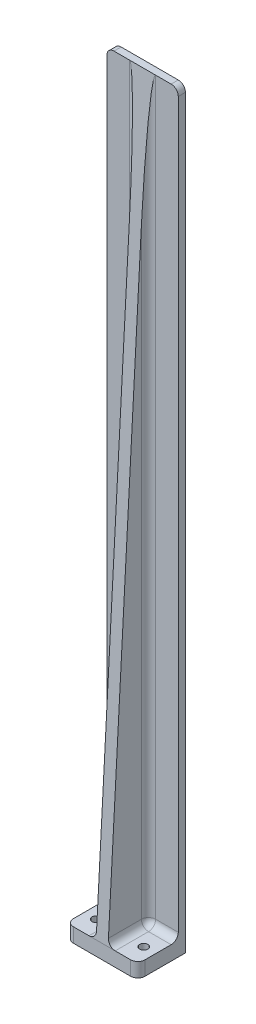
ISO-10303-21;
HEADER;
FILE_DESCRIPTION(('STEP AP214'),'2;1');
FILE_NAME('part.step','',(''),(''),'','','');
FILE_SCHEMA(('AUTOMOTIVE_DESIGN { 1 0 10303 214 1 1 1 1 }'));
ENDSEC;
DATA;
#1=APPLICATION_CONTEXT('core data for automotive mechanical design processes');
#2=APPLICATION_PROTOCOL_DEFINITION('international standard','automotive_design',2000,#1);
#3=PRODUCT_CONTEXT('',#1,'mechanical');
#4=PRODUCT('Part','Part','',(#3));
#5=PRODUCT_RELATED_PRODUCT_CATEGORY('part','',(#4));
#6=PRODUCT_DEFINITION_FORMATION('','',#4);
#7=PRODUCT_DEFINITION_CONTEXT('part definition',#1,'design');
#8=PRODUCT_DEFINITION('design','',#6,#7);
#9=PRODUCT_DEFINITION_SHAPE('','',#8);
#10=(LENGTH_UNIT() NAMED_UNIT(*) SI_UNIT(.MILLI.,.METRE.));
#11=(NAMED_UNIT(*) PLANE_ANGLE_UNIT() SI_UNIT($,.RADIAN.));
#12=(NAMED_UNIT(*) SI_UNIT($,.STERADIAN.) SOLID_ANGLE_UNIT());
#13=UNCERTAINTY_MEASURE_WITH_UNIT(LENGTH_MEASURE(1.E-05),#10,'distance_accuracy_value','');
#14=(GEOMETRIC_REPRESENTATION_CONTEXT(3) GLOBAL_UNCERTAINTY_ASSIGNED_CONTEXT((#13)) GLOBAL_UNIT_ASSIGNED_CONTEXT((#10,
#11,#12)) REPRESENTATION_CONTEXT('',''));
#15=CARTESIAN_POINT('',(0.,0.,0.));
#16=DIRECTION('',(0.,0.,1.));
#17=DIRECTION('',(1.,0.,0.));
#18=AXIS2_PLACEMENT_3D('',#15,#16,#17);
#19=CARTESIAN_POINT('',(0.,6.,0.));
#20=DIRECTION('',(0.,-1.,0.));
#21=DIRECTION('',(0.,0.,-1.));
#22=AXIS2_PLACEMENT_3D('',#19,#20,#21);
#23=PLANE('',#22);
#24=CARTESIAN_POINT('',(10.,6.,2.5));
#25=DIRECTION('',(0.,1.,0.));
#26=DIRECTION('',(0.,0.,-1.));
#27=AXIS2_PLACEMENT_3D('',#24,#25,#26);
#28=CIRCLE('',#27,1.75);
#29=CARTESIAN_POINT('',(10.,6.,0.75));
#30=VERTEX_POINT('',#29);
#31=EDGE_CURVE('E392',#30,#30,#28,.T.);
#32=ORIENTED_EDGE('',*,*,#31,.F.);
#33=EDGE_LOOP('',(#32));
#34=FACE_BOUND('',#33,.T.);
#35=DIRECTION('',(1.,0.,0.));
#36=VECTOR('',#35,1.);
#37=CARTESIAN_POINT('',(-15.,6.,10.));
#38=LINE('',#37,#36);
#39=CARTESIAN_POINT('',(5.5,6.,10.));
#40=VERTEX_POINT('',#39);
#41=CARTESIAN_POINT('',(12.,6.,10.));
#42=VERTEX_POINT('',#41);
#43=EDGE_CURVE('E412',#40,#42,#38,.T.);
#44=ORIENTED_EDGE('',*,*,#43,.T.);
#45=CARTESIAN_POINT('',(12.,6.,7.));
#46=DIRECTION('',(0.,-1.,0.));
#47=DIRECTION('',(0.,0.,-1.));
#48=AXIS2_PLACEMENT_3D('',#45,#46,#47);
#49=CIRCLE('',#48,3.);
#50=CARTESIAN_POINT('',(15.,6.,7.));
#51=VERTEX_POINT('',#50);
#52=EDGE_CURVE('E276',#42,#51,#49,.F.);
#53=ORIENTED_EDGE('',*,*,#52,.T.);
#54=DIRECTION('',(0.,0.,-1.));
#55=VECTOR('',#54,1.);
#56=CARTESIAN_POINT('',(15.,6.,10.));
#57=LINE('',#56,#55);
#58=CARTESIAN_POINT('',(15.,6.,-4.));
#59=VERTEX_POINT('',#58);
#60=EDGE_CURVE('E210',#51,#59,#57,.T.);
#61=ORIENTED_EDGE('',*,*,#60,.T.);
#62=DIRECTION('',(1.,0.,0.));
#63=VECTOR('',#62,1.);
#64=CARTESIAN_POINT('',(0.,6.,-4.));
#65=LINE('',#64,#63);
#66=CARTESIAN_POINT('',(5.5,6.,-4.));
#67=VERTEX_POINT('',#66);
#68=EDGE_CURVE('E273',#59,#67,#65,.F.);
#69=ORIENTED_EDGE('',*,*,#68,.T.);
#70=DIRECTION('',(0.,0.,-1.));
#71=VECTOR('',#70,1.);
#72=CARTESIAN_POINT('',(5.5,6.,10.));
#73=LINE('',#72,#71);
#74=EDGE_CURVE('E269',#67,#40,#73,.F.);
#75=ORIENTED_EDGE('',*,*,#74,.T.);
#76=EDGE_LOOP('',(#44,#53,#61,#69,#75));
#77=FACE_BOUND('',#76,.T.);
#78=ADVANCED_FACE('F45',(#34,#77),#23,.F.);
#79=CARTESIAN_POINT('',(-15.,6.,-7.));
#80=DIRECTION('',(0.,0.,1.));
#81=DIRECTION('',(1.,0.,0.));
#82=AXIS2_PLACEMENT_3D('',#79,#80,#81);
#83=PLANE('',#82);
#84=DIRECTION('',(0.,-1.,0.));
#85=VECTOR('',#84,1.);
#86=CARTESIAN_POINT('',(15.,6.,-7.));
#87=LINE('',#86,#85);
#88=CARTESIAN_POINT('',(15.,313.,-7.));
#89=VERTEX_POINT('',#88);
#90=CARTESIAN_POINT('',(15.,9.,-7.));
#91=VERTEX_POINT('',#90);
#92=EDGE_CURVE('E376',#89,#91,#87,.T.);
#93=ORIENTED_EDGE('',*,*,#92,.F.);
#94=CARTESIAN_POINT('',(12.,313.,-7.));
#95=DIRECTION('',(0.,0.,1.));
#96=DIRECTION('',(1.,0.,0.));
#97=AXIS2_PLACEMENT_3D('',#94,#95,#96);
#98=CIRCLE('',#97,3.);
#99=CARTESIAN_POINT('',(12.,316.,-7.));
#100=VERTEX_POINT('',#99);
#101=EDGE_CURVE('E253',#89,#100,#98,.T.);
#102=ORIENTED_EDGE('',*,*,#101,.T.);
#103=DIRECTION('',(1.,0.,0.));
#104=VECTOR('',#103,1.);
#105=CARTESIAN_POINT('',(-15.,316.,-7.));
#106=LINE('',#105,#104);
#107=CARTESIAN_POINT('',(5.5,316.,-7.));
#108=VERTEX_POINT('',#107);
#109=EDGE_CURVE('E385',#108,#100,#106,.T.);
#110=ORIENTED_EDGE('',*,*,#109,.F.);
#111=DIRECTION('',(0.,1.,0.));
#112=VECTOR('',#111,1.);
#113=CARTESIAN_POINT('',(5.5,6.,-7.));
#114=LINE('',#113,#112);
#115=CARTESIAN_POINT('',(5.5,9.,-7.));
#116=VERTEX_POINT('',#115);
#117=EDGE_CURVE('E246',#108,#116,#114,.F.);
#118=ORIENTED_EDGE('',*,*,#117,.T.);
#119=DIRECTION('',(1.,0.,0.));
#120=VECTOR('',#119,1.);
#121=CARTESIAN_POINT('',(-15.,9.,-7.));
#122=LINE('',#121,#120);
#123=EDGE_CURVE('E249',#116,#91,#122,.T.);
#124=ORIENTED_EDGE('',*,*,#123,.T.);
#125=EDGE_LOOP('',(#93,#102,#110,#118,#124));
#126=FACE_BOUND('',#125,.T.);
#127=ADVANCED_FACE('F457',(#126),#83,.T.);
#128=CARTESIAN_POINT('',(-10.,6.,2.5));
#129=DIRECTION('',(0.,1.,0.));
#130=DIRECTION('',(0.,0.,1.));
#131=AXIS2_PLACEMENT_3D('',#128,#129,#130);
#132=CIRCLE('',#131,1.75);
#133=CARTESIAN_POINT('',(-10.,6.,4.25));
#134=VERTEX_POINT('',#133);
#135=EDGE_CURVE('E182',#134,#134,#132,.T.);
#136=ORIENTED_EDGE('',*,*,#135,.F.);
#137=EDGE_LOOP('',(#136));
#138=FACE_BOUND('',#137,.T.);
#139=DIRECTION('',(0.,0.,1.));
#140=VECTOR('',#139,1.);
#141=CARTESIAN_POINT('',(-15.,6.,10.));
#142=LINE('',#141,#140);
#143=CARTESIAN_POINT('',(-15.,6.,-4.));
#144=VERTEX_POINT('',#143);
#145=CARTESIAN_POINT('',(-15.,6.,7.));
#146=VERTEX_POINT('',#145);
#147=EDGE_CURVE('E410',#144,#146,#142,.T.);
#148=ORIENTED_EDGE('',*,*,#147,.T.);
#149=CARTESIAN_POINT('',(-12.,6.,7.));
#150=DIRECTION('',(0.,-1.,0.));
#151=DIRECTION('',(0.,0.,-1.));
#152=AXIS2_PLACEMENT_3D('',#149,#150,#151);
#153=CIRCLE('',#152,3.);
#154=CARTESIAN_POINT('',(-12.,6.,10.));
#155=VERTEX_POINT('',#154);
#156=EDGE_CURVE('E286',#146,#155,#153,.F.);
#157=ORIENTED_EDGE('',*,*,#156,.T.);
#158=CARTESIAN_POINT('',(-5.5,6.,10.));
#159=VERTEX_POINT('',#158);
#160=EDGE_CURVE('E212',#155,#159,#38,.T.);
#161=ORIENTED_EDGE('',*,*,#160,.T.);
#162=DIRECTION('',(0.,0.,-1.));
#163=VECTOR('',#162,1.);
#164=CARTESIAN_POINT('',(-5.5,6.,0.));
#165=LINE('',#164,#163);
#166=CARTESIAN_POINT('',(-5.5,6.,-4.));
#167=VERTEX_POINT('',#166);
#168=EDGE_CURVE('E282',#159,#167,#165,.T.);
#169=ORIENTED_EDGE('',*,*,#168,.T.);
#170=DIRECTION('',(1.,0.,0.));
#171=VECTOR('',#170,1.);
#172=CARTESIAN_POINT('',(0.,6.,-4.));
#173=LINE('',#172,#171);
#174=EDGE_CURVE('E279',#167,#144,#173,.F.);
#175=ORIENTED_EDGE('',*,*,#174,.T.);
#176=EDGE_LOOP('',(#148,#157,#161,#169,#175));
#177=FACE_BOUND('',#176,.T.);
#178=ADVANCED_FACE('F350',(#138,#177),#23,.F.);
#179=CARTESIAN_POINT('',(0.,0.,0.));
#180=DIRECTION('',(0.,-1.,0.));
#181=DIRECTION('',(0.,0.,-1.));
#182=AXIS2_PLACEMENT_3D('',#179,#180,#181);
#183=PLANE('',#182);
#184=CARTESIAN_POINT('',(-10.,0.,2.5));
#185=DIRECTION('',(0.,1.,0.));
#186=DIRECTION('',(0.,0.,1.));
#187=AXIS2_PLACEMENT_3D('',#184,#185,#186);
#188=CIRCLE('',#187,1.75);
#189=CARTESIAN_POINT('',(-10.,0.,4.25));
#190=VERTEX_POINT('',#189);
#191=EDGE_CURVE('E396',#190,#190,#188,.T.);
#192=ORIENTED_EDGE('',*,*,#191,.T.);
#193=EDGE_LOOP('',(#192));
#194=FACE_BOUND('',#193,.T.);
#195=DIRECTION('',(0.,0.,-1.));
#196=VECTOR('',#195,1.);
#197=CARTESIAN_POINT('',(15.,0.,10.));
#198=LINE('',#197,#196);
#199=CARTESIAN_POINT('',(15.,0.,7.));
#200=VERTEX_POINT('',#199);
#201=CARTESIAN_POINT('',(15.,0.,-10.));
#202=VERTEX_POINT('',#201);
#203=EDGE_CURVE('E169',#200,#202,#198,.T.);
#204=ORIENTED_EDGE('',*,*,#203,.F.);
#205=CARTESIAN_POINT('',(12.,0.,7.));
#206=DIRECTION('',(0.,-1.,0.));
#207=DIRECTION('',(0.,0.,-1.));
#208=AXIS2_PLACEMENT_3D('',#205,#206,#207);
#209=CIRCLE('',#208,3.);
#210=CARTESIAN_POINT('',(12.,0.,10.));
#211=VERTEX_POINT('',#210);
#212=EDGE_CURVE('E259',#200,#211,#209,.T.);
#213=ORIENTED_EDGE('',*,*,#212,.T.);
#214=DIRECTION('',(1.,0.,0.));
#215=VECTOR('',#214,1.);
#216=CARTESIAN_POINT('',(-15.,0.,10.));
#217=LINE('',#216,#215);
#218=CARTESIAN_POINT('',(-12.,0.,10.));
#219=VERTEX_POINT('',#218);
#220=EDGE_CURVE('E203',#219,#211,#217,.T.);
#221=ORIENTED_EDGE('',*,*,#220,.F.);
#222=CARTESIAN_POINT('',(-12.,0.,7.));
#223=DIRECTION('',(0.,-1.,0.));
#224=DIRECTION('',(0.,0.,-1.));
#225=AXIS2_PLACEMENT_3D('',#222,#223,#224);
#226=CIRCLE('',#225,3.);
#227=CARTESIAN_POINT('',(-15.,0.,7.));
#228=VERTEX_POINT('',#227);
#229=EDGE_CURVE('E256',#219,#228,#226,.T.);
#230=ORIENTED_EDGE('',*,*,#229,.T.);
#231=DIRECTION('',(0.,0.,1.));
#232=VECTOR('',#231,1.);
#233=CARTESIAN_POINT('',(-15.,0.,10.));
#234=LINE('',#233,#232);
#235=CARTESIAN_POINT('',(-15.,0.,-10.));
#236=VERTEX_POINT('',#235);
#237=EDGE_CURVE('E199',#236,#228,#234,.T.);
#238=ORIENTED_EDGE('',*,*,#237,.F.);
#239=DIRECTION('',(-1.,0.,0.));
#240=VECTOR('',#239,1.);
#241=CARTESIAN_POINT('',(-15.,0.,-10.));
#242=LINE('',#241,#240);
#243=EDGE_CURVE('E181',#202,#236,#242,.T.);
#244=ORIENTED_EDGE('',*,*,#243,.F.);
#245=EDGE_LOOP('',(#204,#213,#221,#230,#238,#244));
#246=FACE_BOUND('',#245,.T.);
#247=CARTESIAN_POINT('',(10.,0.,2.5));
#248=DIRECTION('',(0.,1.,0.));
#249=DIRECTION('',(0.,0.,-1.));
#250=AXIS2_PLACEMENT_3D('',#247,#248,#249);
#251=CIRCLE('',#250,1.75);
#252=CARTESIAN_POINT('',(10.,0.,0.75));
#253=VERTEX_POINT('',#252);
#254=EDGE_CURVE('E397',#253,#253,#251,.T.);
#255=ORIENTED_EDGE('',*,*,#254,.T.);
#256=EDGE_LOOP('',(#255));
#257=FACE_BOUND('',#256,.T.);
#258=ADVANCED_FACE('F196',(#194,#246,#257),#183,.T.);
#259=CARTESIAN_POINT('',(15.,6.,10.));
#260=DIRECTION('',(-1.,0.,0.));
#261=DIRECTION('',(0.,0.,1.));
#262=AXIS2_PLACEMENT_3D('',#259,#260,#261);
#263=PLANE('',#262);
#264=DIRECTION('',(0.,-1.,0.));
#265=VECTOR('',#264,1.);
#266=CARTESIAN_POINT('',(15.,6.,-10.));
#267=LINE('',#266,#265);
#268=CARTESIAN_POINT('',(15.,313.,-10.));
#269=VERTEX_POINT('',#268);
#270=EDGE_CURVE('E173',#269,#202,#267,.T.);
#271=ORIENTED_EDGE('',*,*,#270,.F.);
#272=DIRECTION('',(0.,0.,1.));
#273=VECTOR('',#272,1.);
#274=CARTESIAN_POINT('',(15.,313.,-7.));
#275=LINE('',#274,#273);
#276=EDGE_CURVE('E243',#269,#89,#275,.T.);
#277=ORIENTED_EDGE('',*,*,#276,.T.);
#278=ORIENTED_EDGE('',*,*,#92,.T.);
#279=CARTESIAN_POINT('',(15.,9.,-4.));
#280=DIRECTION('',(-1.,0.,0.));
#281=DIRECTION('',(0.,0.,1.));
#282=AXIS2_PLACEMENT_3D('',#279,#280,#281);
#283=CIRCLE('',#282,3.);
#284=EDGE_CURVE('E301',#91,#59,#283,.T.);
#285=ORIENTED_EDGE('',*,*,#284,.T.);
#286=ORIENTED_EDGE('',*,*,#60,.F.);
#287=DIRECTION('',(0.,-1.,0.));
#288=VECTOR('',#287,1.);
#289=CARTESIAN_POINT('',(15.,6.,7.));
#290=LINE('',#289,#288);
#291=EDGE_CURVE('E177',#51,#200,#290,.T.);
#292=ORIENTED_EDGE('',*,*,#291,.T.);
#293=ORIENTED_EDGE('',*,*,#203,.T.);
#294=EDGE_LOOP('',(#271,#277,#278,#285,#286,#292,#293));
#295=FACE_BOUND('',#294,.T.);
#296=ADVANCED_FACE('F171',(#295),#263,.F.);
#297=CARTESIAN_POINT('',(-15.,6.,-10.));
#298=DIRECTION('',(0.,0.,1.));
#299=DIRECTION('',(1.,0.,0.));
#300=AXIS2_PLACEMENT_3D('',#297,#298,#299);
#301=PLANE('',#300);
#302=DIRECTION('',(0.,-1.,0.));
#303=VECTOR('',#302,1.);
#304=CARTESIAN_POINT('',(-15.,6.,-10.));
#305=LINE('',#304,#303);
#306=CARTESIAN_POINT('',(-15.,313.,-10.));
#307=VERTEX_POINT('',#306);
#308=EDGE_CURVE('E194',#307,#236,#305,.T.);
#309=ORIENTED_EDGE('',*,*,#308,.F.);
#310=CARTESIAN_POINT('',(-12.,313.,-10.));
#311=DIRECTION('',(0.,0.,1.));
#312=DIRECTION('',(1.,0.,0.));
#313=AXIS2_PLACEMENT_3D('',#310,#311,#312);
#314=CIRCLE('',#313,3.);
#315=CARTESIAN_POINT('',(-12.,316.,-10.));
#316=VERTEX_POINT('',#315);
#317=EDGE_CURVE('E238',#307,#316,#314,.F.);
#318=ORIENTED_EDGE('',*,*,#317,.T.);
#319=DIRECTION('',(1.,0.,0.));
#320=VECTOR('',#319,1.);
#321=CARTESIAN_POINT('',(-15.,316.,-10.));
#322=LINE('',#321,#320);
#323=CARTESIAN_POINT('',(12.,316.,-10.));
#324=VERTEX_POINT('',#323);
#325=EDGE_CURVE('E381',#316,#324,#322,.T.);
#326=ORIENTED_EDGE('',*,*,#325,.T.);
#327=CARTESIAN_POINT('',(12.,313.,-10.));
#328=DIRECTION('',(0.,0.,1.));
#329=DIRECTION('',(1.,0.,0.));
#330=AXIS2_PLACEMENT_3D('',#327,#328,#329);
#331=CIRCLE('',#330,3.);
#332=EDGE_CURVE('E191',#324,#269,#331,.F.);
#333=ORIENTED_EDGE('',*,*,#332,.T.);
#334=ORIENTED_EDGE('',*,*,#270,.T.);
#335=ORIENTED_EDGE('',*,*,#243,.T.);
#336=EDGE_LOOP('',(#309,#318,#326,#333,#334,#335));
#337=FACE_BOUND('',#336,.T.);
#338=ADVANCED_FACE('F187',(#337),#301,.F.);
#339=CARTESIAN_POINT('',(-15.,6.,10.));
#340=DIRECTION('',(1.,0.,0.));
#341=DIRECTION('',(0.,0.,-1.));
#342=AXIS2_PLACEMENT_3D('',#339,#340,#341);
#343=PLANE('',#342);
#344=DIRECTION('',(0.,-1.,0.));
#345=VECTOR('',#344,1.);
#346=CARTESIAN_POINT('',(-15.,6.,-7.));
#347=LINE('',#346,#345);
#348=CARTESIAN_POINT('',(-15.,313.,-7.));
#349=VERTEX_POINT('',#348);
#350=CARTESIAN_POINT('',(-15.,9.,-7.));
#351=VERTEX_POINT('',#350);
#352=EDGE_CURVE('E377',#349,#351,#347,.T.);
#353=ORIENTED_EDGE('',*,*,#352,.F.);
#354=DIRECTION('',(0.,0.,1.));
#355=VECTOR('',#354,1.);
#356=CARTESIAN_POINT('',(-15.,313.,-10.));
#357=LINE('',#356,#355);
#358=EDGE_CURVE('E233',#349,#307,#357,.F.);
#359=ORIENTED_EDGE('',*,*,#358,.T.);
#360=ORIENTED_EDGE('',*,*,#308,.T.);
#361=ORIENTED_EDGE('',*,*,#237,.T.);
#362=DIRECTION('',(0.,-1.,0.));
#363=VECTOR('',#362,1.);
#364=CARTESIAN_POINT('',(-15.,6.,7.));
#365=LINE('',#364,#363);
#366=EDGE_CURVE('E230',#228,#146,#365,.F.);
#367=ORIENTED_EDGE('',*,*,#366,.T.);
#368=ORIENTED_EDGE('',*,*,#147,.F.);
#369=CARTESIAN_POINT('',(-15.,9.,-4.));
#370=DIRECTION('',(1.,0.,0.));
#371=DIRECTION('',(0.,0.,-1.));
#372=AXIS2_PLACEMENT_3D('',#369,#370,#371);
#373=CIRCLE('',#372,3.);
#374=EDGE_CURVE('E11',#144,#351,#373,.T.);
#375=ORIENTED_EDGE('',*,*,#374,.T.);
#376=EDGE_LOOP('',(#353,#359,#360,#361,#367,#368,#375));
#377=FACE_BOUND('',#376,.T.);
#378=ADVANCED_FACE('F432',(#377),#343,.F.);
#379=CARTESIAN_POINT('',(-15.,6.,10.));
#380=DIRECTION('',(0.,0.,-1.));
#381=DIRECTION('',(-1.,0.,0.));
#382=AXIS2_PLACEMENT_3D('',#379,#380,#381);
#383=PLANE('',#382);
#384=ORIENTED_EDGE('',*,*,#220,.T.);
#385=DIRECTION('',(0.,-1.,0.));
#386=VECTOR('',#385,1.);
#387=CARTESIAN_POINT('',(12.,6.,10.));
#388=LINE('',#387,#386);
#389=EDGE_CURVE('E266',#211,#42,#388,.F.);
#390=ORIENTED_EDGE('',*,*,#389,.T.);
#391=ORIENTED_EDGE('',*,*,#43,.F.);
#392=DIRECTION('',(-1.,0.,0.));
#393=VECTOR('',#392,1.);
#394=CARTESIAN_POINT('',(2.5,6.,10.));
#395=LINE('',#394,#393);
#396=EDGE_CURVE('E64',#40,#159,#395,.T.);
#397=ORIENTED_EDGE('',*,*,#396,.T.);
#398=ORIENTED_EDGE('',*,*,#160,.F.);
#399=DIRECTION('',(0.,-1.,0.));
#400=VECTOR('',#399,1.);
#401=CARTESIAN_POINT('',(-12.,6.,10.));
#402=LINE('',#401,#400);
#403=EDGE_CURVE('E262',#155,#219,#402,.T.);
#404=ORIENTED_EDGE('',*,*,#403,.T.);
#405=EDGE_LOOP('',(#384,#390,#391,#397,#398,#404));
#406=FACE_BOUND('',#405,.T.);
#407=ADVANCED_FACE('F424',(#406),#383,.F.);
#408=CARTESIAN_POINT('',(-10.,6.,2.5));
#409=DIRECTION('',(0.,-1.,0.));
#410=DIRECTION('',(0.,0.,-1.));
#411=AXIS2_PLACEMENT_3D('',#408,#409,#410);
#412=CYLINDRICAL_SURFACE('',#411,1.75);
#413=ORIENTED_EDGE('',*,*,#135,.T.);
#414=EDGE_LOOP('',(#413));
#415=FACE_BOUND('',#414,.T.);
#416=ORIENTED_EDGE('',*,*,#191,.F.);
#417=EDGE_LOOP('',(#416));
#418=FACE_BOUND('',#417,.T.);
#419=ADVANCED_FACE('F477',(#415,#418),#412,.F.);
#420=CARTESIAN_POINT('',(10.,6.,2.5));
#421=DIRECTION('',(0.,-1.,0.));
#422=DIRECTION('',(0.,0.,-1.));
#423=AXIS2_PLACEMENT_3D('',#420,#421,#422);
#424=CYLINDRICAL_SURFACE('',#423,1.75);
#425=ORIENTED_EDGE('',*,*,#31,.T.);
#426=EDGE_LOOP('',(#425));
#427=FACE_BOUND('',#426,.T.);
#428=ORIENTED_EDGE('',*,*,#254,.F.);
#429=EDGE_LOOP('',(#428));
#430=FACE_BOUND('',#429,.T.);
#431=ADVANCED_FACE('F480',(#427,#430),#424,.F.);
#432=CARTESIAN_POINT('',(-12.,316.,-7.));
#433=VERTEX_POINT('',#432);
#434=CARTESIAN_POINT('',(-5.5,316.,-7.));
#435=VERTEX_POINT('',#434);
#436=EDGE_CURVE('E389',#433,#435,#106,.T.);
#437=ORIENTED_EDGE('',*,*,#436,.F.);
#438=CARTESIAN_POINT('',(-12.,313.,-7.));
#439=DIRECTION('',(0.,0.,1.));
#440=DIRECTION('',(1.,0.,0.));
#441=AXIS2_PLACEMENT_3D('',#438,#439,#440);
#442=CIRCLE('',#441,3.);
#443=EDGE_CURVE('E227',#433,#349,#442,.T.);
#444=ORIENTED_EDGE('',*,*,#443,.T.);
#445=ORIENTED_EDGE('',*,*,#352,.T.);
#446=DIRECTION('',(1.,0.,0.));
#447=VECTOR('',#446,1.);
#448=CARTESIAN_POINT('',(-15.,9.,-7.));
#449=LINE('',#448,#447);
#450=CARTESIAN_POINT('',(-5.5,9.,-7.));
#451=VERTEX_POINT('',#450);
#452=EDGE_CURVE('E220',#351,#451,#449,.T.);
#453=ORIENTED_EDGE('',*,*,#452,.T.);
#454=DIRECTION('',(0.,1.,0.));
#455=VECTOR('',#454,1.);
#456=CARTESIAN_POINT('',(-5.5,316.,-7.));
#457=LINE('',#456,#455);
#458=EDGE_CURVE('E223',#451,#435,#457,.T.);
#459=ORIENTED_EDGE('',*,*,#458,.T.);
#460=EDGE_LOOP('',(#437,#444,#445,#453,#459));
#461=FACE_BOUND('',#460,.T.);
#462=ADVANCED_FACE('F444',(#461),#83,.T.);
#463=CARTESIAN_POINT('',(-15.,316.,-10.));
#464=DIRECTION('',(0.,1.,0.));
#465=DIRECTION('',(0.,0.,1.));
#466=AXIS2_PLACEMENT_3D('',#463,#464,#465);
#467=PLANE('',#466);
#468=ORIENTED_EDGE('',*,*,#325,.F.);
#469=DIRECTION('',(0.,0.,1.));
#470=VECTOR('',#469,1.);
#471=CARTESIAN_POINT('',(-12.,316.,-7.));
#472=LINE('',#471,#470);
#473=EDGE_CURVE('E216',#316,#433,#472,.T.);
#474=ORIENTED_EDGE('',*,*,#473,.T.);
#475=ORIENTED_EDGE('',*,*,#436,.T.);
#476=DIRECTION('',(-1.,0.,0.));
#477=VECTOR('',#476,1.);
#478=CARTESIAN_POINT('',(2.5,316.,-7.));
#479=LINE('',#478,#477);
#480=EDGE_CURVE('E373',#108,#435,#479,.T.);
#481=ORIENTED_EDGE('',*,*,#480,.F.);
#482=ORIENTED_EDGE('',*,*,#109,.T.);
#483=DIRECTION('',(0.,0.,1.));
#484=VECTOR('',#483,1.);
#485=CARTESIAN_POINT('',(12.,316.,-10.));
#486=LINE('',#485,#484);
#487=EDGE_CURVE('E193',#100,#324,#486,.F.);
#488=ORIENTED_EDGE('',*,*,#487,.T.);
#489=EDGE_LOOP('',(#468,#474,#475,#481,#482,#488));
#490=FACE_BOUND('',#489,.T.);
#491=ADVANCED_FACE('F442',(#490),#467,.T.);
#492=CARTESIAN_POINT('',(2.5,316.,-7.));
#493=DIRECTION('',(0.,-0.0547564374037947,-0.998499740892728));
#494=DIRECTION('',(0.,0.998499740892728,-0.0547564374037948));
#495=AXIS2_PLACEMENT_3D('',#492,#493,#494);
#496=PLANE('',#495);
#497=ORIENTED_EDGE('',*,*,#480,.T.);
#498=CARTESIAN_POINT('',(-5.5,261.294117647059,-4.));
#499=DIRECTION('',(0.,-0.0547564374037947,-0.998499740892728));
#500=DIRECTION('',(0.,-0.998499740892728,0.0547564374037948));
#501=AXIS2_PLACEMENT_3D('',#498,#499,#500);
#502=ELLIPSE('',#501,54.7880786669312,3.);
#503=CARTESIAN_POINT('',(-2.5,261.294117647059,-4.));
#504=VERTEX_POINT('',#503);
#505=EDGE_CURVE('E56',#435,#504,#502,.T.);
#506=ORIENTED_EDGE('',*,*,#505,.T.);
#507=DIRECTION('',(0.,-0.998499740892728,0.0547564374037947));
#508=VECTOR('',#507,1.);
#509=CARTESIAN_POINT('',(-2.5,316.,-7.));
#510=LINE('',#509,#508);
#511=CARTESIAN_POINT('',(-2.5,9.00000000000001,9.83548387096774));
#512=VERTEX_POINT('',#511);
#513=EDGE_CURVE('E329',#504,#512,#510,.T.);
#514=ORIENTED_EDGE('',*,*,#513,.T.);
#515=CARTESIAN_POINT('',(-5.5,9.,9.83548387096774));
#516=DIRECTION('',(0.,-0.0547564374037947,-0.998499740892728));
#517=DIRECTION('',(0.,0.998499740892728,-0.0547564374037948));
#518=AXIS2_PLACEMENT_3D('',#515,#516,#517);
#519=ELLIPSE('',#518,3.00450753979945,3.);
#520=EDGE_CURVE('E311',#512,#159,#519,.T.);
#521=ORIENTED_EDGE('',*,*,#520,.T.);
#522=ORIENTED_EDGE('',*,*,#396,.F.);
#523=CARTESIAN_POINT('',(5.5,9.,9.83548387096774));
#524=DIRECTION('',(0.,-0.0547564374037947,-0.998499740892728));
#525=DIRECTION('',(0.,-0.998499740892728,0.0547564374037948));
#526=AXIS2_PLACEMENT_3D('',#523,#524,#525);
#527=ELLIPSE('',#526,3.00450753979945,3.);
#528=CARTESIAN_POINT('',(2.5,9.00000000000001,9.83548387096774));
#529=VERTEX_POINT('',#528);
#530=EDGE_CURVE('E308',#40,#529,#527,.T.);
#531=ORIENTED_EDGE('',*,*,#530,.T.);
#532=DIRECTION('',(0.,-0.998499740892728,0.0547564374037947));
#533=VECTOR('',#532,1.);
#534=CARTESIAN_POINT('',(2.5,316.,-7.));
#535=LINE('',#534,#533);
#536=CARTESIAN_POINT('',(2.5,261.294117647059,-4.));
#537=VERTEX_POINT('',#536);
#538=EDGE_CURVE('E365',#537,#529,#535,.T.);
#539=ORIENTED_EDGE('',*,*,#538,.F.);
#540=CARTESIAN_POINT('',(5.5,261.294117647059,-4.));
#541=DIRECTION('',(0.,-0.0547564374037947,-0.998499740892728));
#542=DIRECTION('',(0.,0.998499740892728,-0.0547564374037948));
#543=AXIS2_PLACEMENT_3D('',#540,#541,#542);
#544=ELLIPSE('',#543,54.7880786669312,3.);
#545=EDGE_CURVE('E304',#537,#108,#544,.T.);
#546=ORIENTED_EDGE('',*,*,#545,.T.);
#547=EDGE_LOOP('',(#497,#506,#514,#521,#522,#531,#539,#546));
#548=FACE_BOUND('',#547,.T.);
#549=ADVANCED_FACE('F362',(#548),#496,.F.);
#550=CARTESIAN_POINT('',(2.5,0.,0.));
#551=DIRECTION('',(-1.,0.,0.));
#552=DIRECTION('',(0.,0.,1.));
#553=AXIS2_PLACEMENT_3D('',#550,#551,#552);
#554=PLANE('',#553);
#555=DIRECTION('',(0.,0.,-1.));
#556=VECTOR('',#555,1.);
#557=CARTESIAN_POINT('',(2.5,9.,-7.));
#558=LINE('',#557,#556);
#559=CARTESIAN_POINT('',(2.5,9.,-4.));
#560=VERTEX_POINT('',#559);
#561=EDGE_CURVE('E289',#529,#560,#558,.T.);
#562=ORIENTED_EDGE('',*,*,#561,.T.);
#563=DIRECTION('',(0.,1.,0.));
#564=VECTOR('',#563,1.);
#565=CARTESIAN_POINT('',(2.5,0.,-4.));
#566=LINE('',#565,#564);
#567=EDGE_CURVE('E292',#560,#537,#566,.T.);
#568=ORIENTED_EDGE('',*,*,#567,.T.);
#569=ORIENTED_EDGE('',*,*,#538,.T.);
#570=EDGE_LOOP('',(#562,#568,#569));
#571=FACE_BOUND('',#570,.T.);
#572=ADVANCED_FACE('F494',(#571),#554,.F.);
#573=CARTESIAN_POINT('',(-2.5,0.,0.));
#574=DIRECTION('',(-1.,0.,0.));
#575=DIRECTION('',(0.,0.,1.));
#576=AXIS2_PLACEMENT_3D('',#573,#574,#575);
#577=PLANE('',#576);
#578=DIRECTION('',(0.,1.,0.));
#579=VECTOR('',#578,1.);
#580=CARTESIAN_POINT('',(-2.5,6.,-4.));
#581=LINE('',#580,#579);
#582=CARTESIAN_POINT('',(-2.5,9.,-4.));
#583=VERTEX_POINT('',#582);
#584=EDGE_CURVE('E295',#504,#583,#581,.F.);
#585=ORIENTED_EDGE('',*,*,#584,.T.);
#586=DIRECTION('',(0.,0.,-1.));
#587=VECTOR('',#586,1.);
#588=CARTESIAN_POINT('',(-2.5,9.,0.));
#589=LINE('',#588,#587);
#590=EDGE_CURVE('E298',#583,#512,#589,.F.);
#591=ORIENTED_EDGE('',*,*,#590,.T.);
#592=ORIENTED_EDGE('',*,*,#513,.F.);
#593=EDGE_LOOP('',(#585,#591,#592));
#594=FACE_BOUND('',#593,.T.);
#595=ADVANCED_FACE('F358',(#594),#577,.T.);
#596=CARTESIAN_POINT('',(-12.,313.,-10.));
#597=DIRECTION('',(0.,0.,-1.));
#598=DIRECTION('',(-1.,0.,0.));
#599=AXIS2_PLACEMENT_3D('',#596,#597,#598);
#600=CYLINDRICAL_SURFACE('',#599,3.);
#601=ORIENTED_EDGE('',*,*,#317,.F.);
#602=ORIENTED_EDGE('',*,*,#358,.F.);
#603=ORIENTED_EDGE('',*,*,#443,.F.);
#604=ORIENTED_EDGE('',*,*,#473,.F.);
#605=EDGE_LOOP('',(#601,#602,#603,#604));
#606=FACE_BOUND('',#605,.T.);
#607=ADVANCED_FACE('F438',(#606),#600,.T.);
#608=CARTESIAN_POINT('',(12.,313.,10.));
#609=DIRECTION('',(0.,0.,-1.));
#610=DIRECTION('',(-1.,0.,0.));
#611=AXIS2_PLACEMENT_3D('',#608,#609,#610);
#612=CYLINDRICAL_SURFACE('',#611,3.);
#613=ORIENTED_EDGE('',*,*,#332,.F.);
#614=ORIENTED_EDGE('',*,*,#487,.F.);
#615=ORIENTED_EDGE('',*,*,#101,.F.);
#616=ORIENTED_EDGE('',*,*,#276,.F.);
#617=EDGE_LOOP('',(#613,#614,#615,#616));
#618=FACE_BOUND('',#617,.T.);
#619=ADVANCED_FACE('F521',(#618),#612,.T.);
#620=CARTESIAN_POINT('',(12.,6.,7.));
#621=DIRECTION('',(0.,-1.,0.));
#622=DIRECTION('',(0.,0.,-1.));
#623=AXIS2_PLACEMENT_3D('',#620,#621,#622);
#624=CYLINDRICAL_SURFACE('',#623,3.);
#625=ORIENTED_EDGE('',*,*,#52,.F.);
#626=ORIENTED_EDGE('',*,*,#389,.F.);
#627=ORIENTED_EDGE('',*,*,#212,.F.);
#628=ORIENTED_EDGE('',*,*,#291,.F.);
#629=EDGE_LOOP('',(#625,#626,#627,#628));
#630=FACE_BOUND('',#629,.T.);
#631=ADVANCED_FACE('F422',(#630),#624,.T.);
#632=CARTESIAN_POINT('',(-12.,6.,7.));
#633=DIRECTION('',(0.,-1.,0.));
#634=DIRECTION('',(0.,0.,-1.));
#635=AXIS2_PLACEMENT_3D('',#632,#633,#634);
#636=CYLINDRICAL_SURFACE('',#635,3.);
#637=ORIENTED_EDGE('',*,*,#156,.F.);
#638=ORIENTED_EDGE('',*,*,#366,.F.);
#639=ORIENTED_EDGE('',*,*,#229,.F.);
#640=ORIENTED_EDGE('',*,*,#403,.F.);
#641=EDGE_LOOP('',(#637,#638,#639,#640));
#642=FACE_BOUND('',#641,.T.);
#643=ADVANCED_FACE('F428',(#642),#636,.T.);
#644=CARTESIAN_POINT('',(5.5,9.,0.));
#645=DIRECTION('',(0.,0.,1.));
#646=DIRECTION('',(1.,0.,0.));
#647=AXIS2_PLACEMENT_3D('',#644,#645,#646);
#648=CYLINDRICAL_SURFACE('',#647,3.);
#649=ORIENTED_EDGE('',*,*,#530,.F.);
#650=ORIENTED_EDGE('',*,*,#74,.F.);
#651=CARTESIAN_POINT('',(5.5,9.,-4.));
#652=DIRECTION('',(0.,0.,1.));
#653=DIRECTION('',(1.,0.,0.));
#654=AXIS2_PLACEMENT_3D('',#651,#652,#653);
#655=CIRCLE('',#654,3.);
#656=EDGE_CURVE('E325',#560,#67,#655,.T.);
#657=ORIENTED_EDGE('',*,*,#656,.F.);
#658=ORIENTED_EDGE('',*,*,#561,.F.);
#659=EDGE_LOOP('',(#649,#650,#657,#658));
#660=FACE_BOUND('',#659,.T.);
#661=ADVANCED_FACE('F512',(#660),#648,.F.);
#662=CARTESIAN_POINT('',(5.5,0.,-4.));
#663=DIRECTION('',(0.,1.,0.));
#664=DIRECTION('',(0.,0.,1.));
#665=AXIS2_PLACEMENT_3D('',#662,#663,#664);
#666=CYLINDRICAL_SURFACE('',#665,3.);
#667=ORIENTED_EDGE('',*,*,#545,.F.);
#668=ORIENTED_EDGE('',*,*,#567,.F.);
#669=CARTESIAN_POINT('',(5.5,9.,-4.));
#670=DIRECTION('',(0.,1.,0.));
#671=DIRECTION('',(0.,0.,1.));
#672=AXIS2_PLACEMENT_3D('',#669,#670,#671);
#673=CIRCLE('',#672,3.);
#674=EDGE_CURVE('E321',#116,#560,#673,.T.);
#675=ORIENTED_EDGE('',*,*,#674,.F.);
#676=ORIENTED_EDGE('',*,*,#117,.F.);
#677=EDGE_LOOP('',(#667,#668,#675,#676));
#678=FACE_BOUND('',#677,.T.);
#679=ADVANCED_FACE('F509',(#678),#666,.F.);
#680=CARTESIAN_POINT('',(5.5,9.,-4.));
#681=DIRECTION('',(-1.,0.,0.));
#682=DIRECTION('',(0.,0.,1.));
#683=AXIS2_PLACEMENT_3D('',#680,#681,#682);
#684=SPHERICAL_SURFACE('',#683,3.);
#685=ORIENTED_EDGE('',*,*,#674,.T.);
#686=ORIENTED_EDGE('',*,*,#656,.T.);
#687=CARTESIAN_POINT('',(5.5,9.,-4.));
#688=DIRECTION('',(1.,0.,0.));
#689=DIRECTION('',(0.,0.,-1.));
#690=AXIS2_PLACEMENT_3D('',#687,#688,#689);
#691=CIRCLE('',#690,3.);
#692=EDGE_CURVE('E317',#116,#67,#691,.F.);
#693=ORIENTED_EDGE('',*,*,#692,.F.);
#694=EDGE_LOOP('',(#685,#686,#693));
#695=FACE_BOUND('',#694,.T.);
#696=ADVANCED_FACE('F514',(#695),#684,.F.);
#697=CARTESIAN_POINT('',(-15.,9.,-4.));
#698=DIRECTION('',(1.,0.,0.));
#699=DIRECTION('',(0.,0.,-1.));
#700=AXIS2_PLACEMENT_3D('',#697,#698,#699);
#701=CYLINDRICAL_SURFACE('',#700,3.);
#702=ORIENTED_EDGE('',*,*,#692,.T.);
#703=ORIENTED_EDGE('',*,*,#68,.F.);
#704=ORIENTED_EDGE('',*,*,#284,.F.);
#705=ORIENTED_EDGE('',*,*,#123,.F.);
#706=EDGE_LOOP('',(#702,#703,#704,#705));
#707=FACE_BOUND('',#706,.T.);
#708=ADVANCED_FACE('F455',(#707),#701,.F.);
#709=CARTESIAN_POINT('',(-15.,9.,-4.));
#710=DIRECTION('',(1.,0.,0.));
#711=DIRECTION('',(0.,0.,-1.));
#712=AXIS2_PLACEMENT_3D('',#709,#710,#711);
#713=CYLINDRICAL_SURFACE('',#712,3.);
#714=ORIENTED_EDGE('',*,*,#374,.F.);
#715=ORIENTED_EDGE('',*,*,#174,.F.);
#716=CARTESIAN_POINT('',(-5.5,9.,-4.));
#717=DIRECTION('',(-1.,0.,0.));
#718=DIRECTION('',(0.,0.,1.));
#719=AXIS2_PLACEMENT_3D('',#716,#717,#718);
#720=CIRCLE('',#719,3.);
#721=EDGE_CURVE('E49',#451,#167,#720,.T.);
#722=ORIENTED_EDGE('',*,*,#721,.F.);
#723=ORIENTED_EDGE('',*,*,#452,.F.);
#724=EDGE_LOOP('',(#714,#715,#722,#723));
#725=FACE_BOUND('',#724,.T.);
#726=ADVANCED_FACE('F47',(#725),#713,.F.);
#727=CARTESIAN_POINT('',(-5.5,6.,-4.));
#728=DIRECTION('',(0.,-1.,0.));
#729=DIRECTION('',(0.,0.,-1.));
#730=AXIS2_PLACEMENT_3D('',#727,#728,#729);
#731=CYLINDRICAL_SURFACE('',#730,3.);
#732=ORIENTED_EDGE('',*,*,#505,.F.);
#733=ORIENTED_EDGE('',*,*,#458,.F.);
#734=CARTESIAN_POINT('',(-5.5,9.,-4.));
#735=DIRECTION('',(0.,1.,0.));
#736=DIRECTION('',(0.,0.,1.));
#737=AXIS2_PLACEMENT_3D('',#734,#735,#736);
#738=CIRCLE('',#737,3.);
#739=EDGE_CURVE('E332',#583,#451,#738,.T.);
#740=ORIENTED_EDGE('',*,*,#739,.F.);
#741=ORIENTED_EDGE('',*,*,#584,.F.);
#742=EDGE_LOOP('',(#732,#733,#740,#741));
#743=FACE_BOUND('',#742,.T.);
#744=ADVANCED_FACE('F448',(#743),#731,.F.);
#745=CARTESIAN_POINT('',(-5.5,9.,-4.));
#746=DIRECTION('',(0.,0.,-1.));
#747=DIRECTION('',(-1.,0.,0.));
#748=AXIS2_PLACEMENT_3D('',#745,#746,#747);
#749=SPHERICAL_SURFACE('',#748,3.);
#750=ORIENTED_EDGE('',*,*,#739,.T.);
#751=ORIENTED_EDGE('',*,*,#721,.T.);
#752=CARTESIAN_POINT('',(-5.5,9.,-4.));
#753=DIRECTION('',(0.,0.,1.));
#754=DIRECTION('',(1.,0.,0.));
#755=AXIS2_PLACEMENT_3D('',#752,#753,#754);
#756=CIRCLE('',#755,3.);
#757=EDGE_CURVE('E330',#583,#167,#756,.F.);
#758=ORIENTED_EDGE('',*,*,#757,.F.);
#759=EDGE_LOOP('',(#750,#751,#758));
#760=FACE_BOUND('',#759,.T.);
#761=ADVANCED_FACE('F342',(#760),#749,.F.);
#762=CARTESIAN_POINT('',(-5.5,9.,0.));
#763=DIRECTION('',(0.,0.,-1.));
#764=DIRECTION('',(-1.,0.,0.));
#765=AXIS2_PLACEMENT_3D('',#762,#763,#764);
#766=CYLINDRICAL_SURFACE('',#765,3.);
#767=ORIENTED_EDGE('',*,*,#520,.F.);
#768=ORIENTED_EDGE('',*,*,#590,.F.);
#769=ORIENTED_EDGE('',*,*,#757,.T.);
#770=ORIENTED_EDGE('',*,*,#168,.F.);
#771=EDGE_LOOP('',(#767,#768,#769,#770));
#772=FACE_BOUND('',#771,.T.);
#773=ADVANCED_FACE('F353',(#772),#766,.F.);
#774=CLOSED_SHELL('',(#78,#127,#178,#258,#296,#338,#378,#407,#419,#431,#462,#491,#549,#572,#595,
#607,#619,#631,#643,#661,#679,#696,#708,#726,#744,#761,#773));
#775=MANIFOLD_SOLID_BREP('B2',#774);
#776=ADVANCED_BREP_SHAPE_REPRESENTATION('',(#18,#775),#14);
#777=SHAPE_DEFINITION_REPRESENTATION(#9,#776);
ENDSEC;
END-ISO-10303-21;
